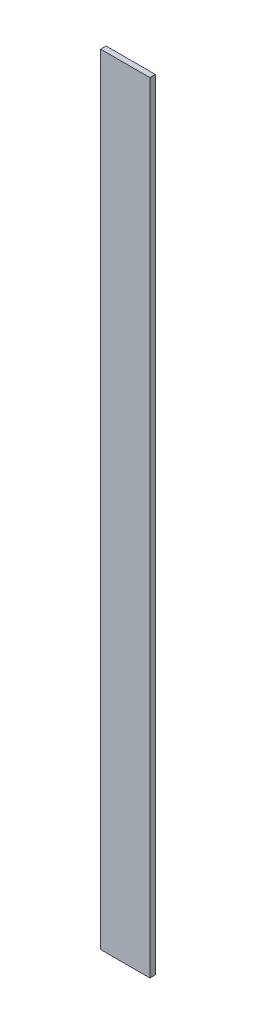
ISO-10303-21;
HEADER;
FILE_DESCRIPTION(('STEP AP214'),'2;1');
FILE_NAME('part.step','',(''),(''),'','','');
FILE_SCHEMA(('AUTOMOTIVE_DESIGN { 1 0 10303 214 1 1 1 1 }'));
ENDSEC;
DATA;
#1=APPLICATION_CONTEXT('core data for automotive mechanical design processes');
#2=APPLICATION_PROTOCOL_DEFINITION('international standard','automotive_design',2000,#1);
#3=PRODUCT_CONTEXT('',#1,'mechanical');
#4=PRODUCT('Part','Part','',(#3));
#5=PRODUCT_RELATED_PRODUCT_CATEGORY('part','',(#4));
#6=PRODUCT_DEFINITION_FORMATION('','',#4);
#7=PRODUCT_DEFINITION_CONTEXT('part definition',#1,'design');
#8=PRODUCT_DEFINITION('design','',#6,#7);
#9=PRODUCT_DEFINITION_SHAPE('','',#8);
#10=(LENGTH_UNIT() NAMED_UNIT(*) SI_UNIT(.MILLI.,.METRE.));
#11=(NAMED_UNIT(*) PLANE_ANGLE_UNIT() SI_UNIT($,.RADIAN.));
#12=(NAMED_UNIT(*) SI_UNIT($,.STERADIAN.) SOLID_ANGLE_UNIT());
#13=UNCERTAINTY_MEASURE_WITH_UNIT(LENGTH_MEASURE(1.E-05),#10,'distance_accuracy_value','');
#14=(GEOMETRIC_REPRESENTATION_CONTEXT(3) GLOBAL_UNCERTAINTY_ASSIGNED_CONTEXT((#13)) GLOBAL_UNIT_ASSIGNED_CONTEXT((#10,
#11,#12)) REPRESENTATION_CONTEXT('',''));
#15=CARTESIAN_POINT('',(0.,0.,0.));
#16=DIRECTION('',(0.,0.,1.));
#17=DIRECTION('',(1.,0.,0.));
#18=AXIS2_PLACEMENT_3D('',#15,#16,#17);
#19=CARTESIAN_POINT('',(0.,0.,3.175));
#20=DIRECTION('',(1.,0.,0.));
#21=DIRECTION('',(0.,0.,-1.));
#22=AXIS2_PLACEMENT_3D('',#19,#20,#21);
#23=PLANE('',#22);
#24=DIRECTION('',(0.,-1.,0.));
#25=VECTOR('',#24,1.);
#26=CARTESIAN_POINT('',(0.,0.,0.));
#27=LINE('',#26,#25);
#28=CARTESIAN_POINT('',(0.,450.,0.));
#29=VERTEX_POINT('',#28);
#30=CARTESIAN_POINT('',(0.,0.,0.));
#31=VERTEX_POINT('',#30);
#32=EDGE_CURVE('E111',#29,#31,#27,.T.);
#33=ORIENTED_EDGE('',*,*,#32,.T.);
#34=DIRECTION('',(0.,0.,-1.));
#35=VECTOR('',#34,1.);
#36=CARTESIAN_POINT('',(0.,0.,3.175));
#37=LINE('',#36,#35);
#38=CARTESIAN_POINT('',(0.,0.,3.175));
#39=VERTEX_POINT('',#38);
#40=EDGE_CURVE('E11',#39,#31,#37,.T.);
#41=ORIENTED_EDGE('',*,*,#40,.F.);
#42=DIRECTION('',(0.,-1.,0.));
#43=VECTOR('',#42,1.);
#44=CARTESIAN_POINT('',(0.,0.,3.175));
#45=LINE('',#44,#43);
#46=CARTESIAN_POINT('',(0.,450.,3.175));
#47=VERTEX_POINT('',#46);
#48=EDGE_CURVE('E95',#47,#39,#45,.T.);
#49=ORIENTED_EDGE('',*,*,#48,.F.);
#50=DIRECTION('',(0.,0.,-1.));
#51=VECTOR('',#50,1.);
#52=CARTESIAN_POINT('',(0.,450.,3.175));
#53=LINE('',#52,#51);
#54=EDGE_CURVE('E107',#47,#29,#53,.T.);
#55=ORIENTED_EDGE('',*,*,#54,.T.);
#56=EDGE_LOOP('',(#33,#41,#49,#55));
#57=FACE_BOUND('',#56,.T.);
#58=ADVANCED_FACE('F43',(#57),#23,.F.);
#59=CARTESIAN_POINT('',(0.,0.,3.175));
#60=DIRECTION('',(0.,1.,0.));
#61=DIRECTION('',(0.,0.,1.));
#62=AXIS2_PLACEMENT_3D('',#59,#60,#61);
#63=PLANE('',#62);
#64=DIRECTION('',(1.,0.,0.));
#65=VECTOR('',#64,1.);
#66=CARTESIAN_POINT('',(0.,0.,0.));
#67=LINE('',#66,#65);
#68=CARTESIAN_POINT('',(28.4,0.,0.));
#69=VERTEX_POINT('',#68);
#70=EDGE_CURVE('E100',#31,#69,#67,.T.);
#71=ORIENTED_EDGE('',*,*,#70,.T.);
#72=DIRECTION('',(0.,0.,-1.));
#73=VECTOR('',#72,1.);
#74=CARTESIAN_POINT('',(28.4,0.,3.175));
#75=LINE('',#74,#73);
#76=CARTESIAN_POINT('',(28.4,0.,3.175));
#77=VERTEX_POINT('',#76);
#78=EDGE_CURVE('E52',#77,#69,#75,.T.);
#79=ORIENTED_EDGE('',*,*,#78,.F.);
#80=DIRECTION('',(1.,0.,0.));
#81=VECTOR('',#80,1.);
#82=CARTESIAN_POINT('',(0.,0.,3.175));
#83=LINE('',#82,#81);
#84=EDGE_CURVE('E90',#39,#77,#83,.T.);
#85=ORIENTED_EDGE('',*,*,#84,.F.);
#86=ORIENTED_EDGE('',*,*,#40,.T.);
#87=EDGE_LOOP('',(#71,#79,#85,#86));
#88=FACE_BOUND('',#87,.T.);
#89=ADVANCED_FACE('F99',(#88),#63,.F.);
#90=CARTESIAN_POINT('',(28.4,0.,3.175));
#91=DIRECTION('',(-1.,0.,0.));
#92=DIRECTION('',(0.,0.,1.));
#93=AXIS2_PLACEMENT_3D('',#90,#91,#92);
#94=PLANE('',#93);
#95=DIRECTION('',(0.,1.,0.));
#96=VECTOR('',#95,1.);
#97=CARTESIAN_POINT('',(28.4,0.,0.));
#98=LINE('',#97,#96);
#99=CARTESIAN_POINT('',(28.4,450.,0.));
#100=VERTEX_POINT('',#99);
#101=EDGE_CURVE('E77',#69,#100,#98,.T.);
#102=ORIENTED_EDGE('',*,*,#101,.T.);
#103=DIRECTION('',(0.,0.,-1.));
#104=VECTOR('',#103,1.);
#105=CARTESIAN_POINT('',(28.4,450.,3.175));
#106=LINE('',#105,#104);
#107=CARTESIAN_POINT('',(28.4,450.,3.175));
#108=VERTEX_POINT('',#107);
#109=EDGE_CURVE('E102',#108,#100,#106,.T.);
#110=ORIENTED_EDGE('',*,*,#109,.F.);
#111=DIRECTION('',(0.,1.,0.));
#112=VECTOR('',#111,1.);
#113=CARTESIAN_POINT('',(28.4,0.,3.175));
#114=LINE('',#113,#112);
#115=EDGE_CURVE('E93',#77,#108,#114,.T.);
#116=ORIENTED_EDGE('',*,*,#115,.F.);
#117=ORIENTED_EDGE('',*,*,#78,.T.);
#118=EDGE_LOOP('',(#102,#110,#116,#117));
#119=FACE_BOUND('',#118,.T.);
#120=ADVANCED_FACE('F103',(#119),#94,.F.);
#121=CARTESIAN_POINT('',(0.,450.,3.175));
#122=DIRECTION('',(0.,-1.,0.));
#123=DIRECTION('',(0.,0.,-1.));
#124=AXIS2_PLACEMENT_3D('',#121,#122,#123);
#125=PLANE('',#124);
#126=DIRECTION('',(-1.,0.,0.));
#127=VECTOR('',#126,1.);
#128=CARTESIAN_POINT('',(0.,450.,0.));
#129=LINE('',#128,#127);
#130=EDGE_CURVE('E83',#100,#29,#129,.T.);
#131=ORIENTED_EDGE('',*,*,#130,.T.);
#132=ORIENTED_EDGE('',*,*,#54,.F.);
#133=DIRECTION('',(-1.,0.,0.));
#134=VECTOR('',#133,1.);
#135=CARTESIAN_POINT('',(0.,450.,3.175));
#136=LINE('',#135,#134);
#137=EDGE_CURVE('E60',#108,#47,#136,.T.);
#138=ORIENTED_EDGE('',*,*,#137,.F.);
#139=ORIENTED_EDGE('',*,*,#109,.T.);
#140=EDGE_LOOP('',(#131,#132,#138,#139));
#141=FACE_BOUND('',#140,.T.);
#142=ADVANCED_FACE('F124',(#141),#125,.F.);
#143=CARTESIAN_POINT('',(0.,0.,3.175));
#144=DIRECTION('',(0.,0.,-1.));
#145=DIRECTION('',(-1.,0.,0.));
#146=AXIS2_PLACEMENT_3D('',#143,#144,#145);
#147=PLANE('',#146);
#148=ORIENTED_EDGE('',*,*,#48,.T.);
#149=ORIENTED_EDGE('',*,*,#84,.T.);
#150=ORIENTED_EDGE('',*,*,#115,.T.);
#151=ORIENTED_EDGE('',*,*,#137,.T.);
#152=EDGE_LOOP('',(#148,#149,#150,#151));
#153=FACE_BOUND('',#152,.T.);
#154=ADVANCED_FACE('F91',(#153),#147,.F.);
#155=CARTESIAN_POINT('',(0.,0.,0.));
#156=DIRECTION('',(0.,0.,-1.));
#157=DIRECTION('',(-1.,0.,0.));
#158=AXIS2_PLACEMENT_3D('',#155,#156,#157);
#159=PLANE('',#158);
#160=ORIENTED_EDGE('',*,*,#32,.F.);
#161=ORIENTED_EDGE('',*,*,#130,.F.);
#162=ORIENTED_EDGE('',*,*,#101,.F.);
#163=ORIENTED_EDGE('',*,*,#70,.F.);
#164=EDGE_LOOP('',(#160,#161,#162,#163));
#165=FACE_BOUND('',#164,.T.);
#166=ADVANCED_FACE('F127',(#165),#159,.T.);
#167=CLOSED_SHELL('',(#58,#89,#120,#142,#154,#166));
#168=MANIFOLD_SOLID_BREP('B2',#167);
#169=ADVANCED_BREP_SHAPE_REPRESENTATION('',(#18,#168),#14);
#170=SHAPE_DEFINITION_REPRESENTATION(#9,#169);
ENDSEC;
END-ISO-10303-21;
